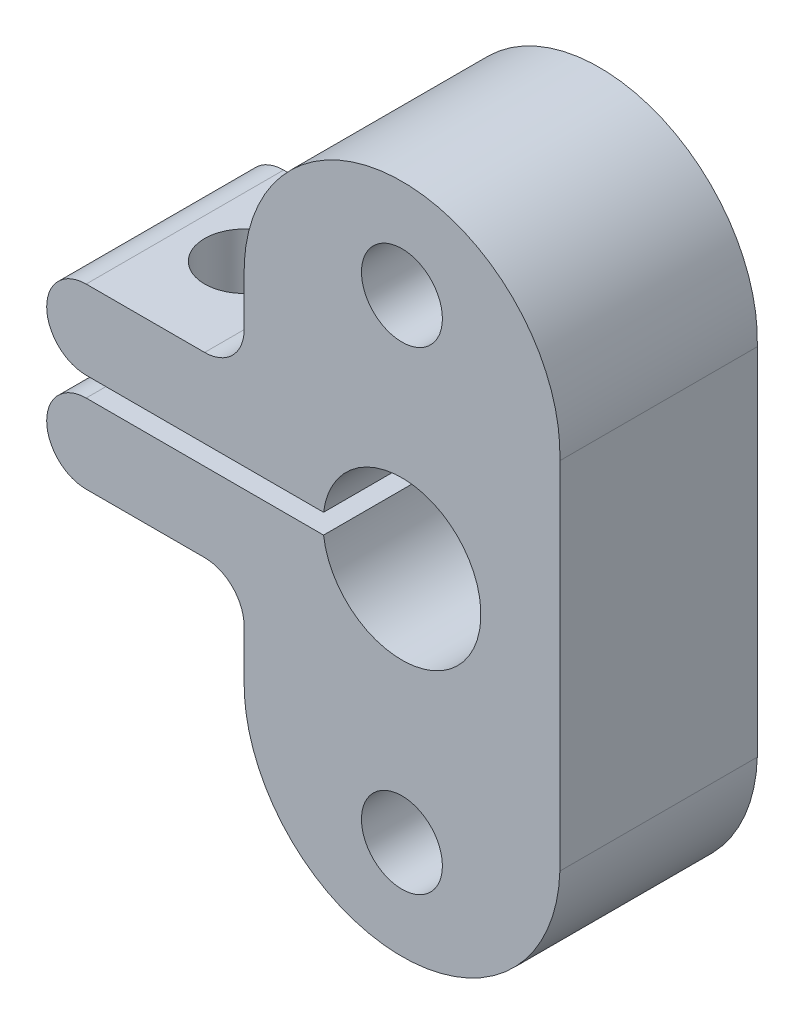
ISO-10303-21;
HEADER;
FILE_DESCRIPTION(('STEP AP214'),'2;1');
FILE_NAME('part.step','',(''),(''),'','','');
FILE_SCHEMA(('AUTOMOTIVE_DESIGN { 1 0 10303 214 1 1 1 1 }'));
ENDSEC;
DATA;
#1=APPLICATION_CONTEXT('core data for automotive mechanical design processes');
#2=APPLICATION_PROTOCOL_DEFINITION('international standard','automotive_design',2000,#1);
#3=PRODUCT_CONTEXT('',#1,'mechanical');
#4=PRODUCT('Part','Part','',(#3));
#5=PRODUCT_RELATED_PRODUCT_CATEGORY('part','',(#4));
#6=PRODUCT_DEFINITION_FORMATION('','',#4);
#7=PRODUCT_DEFINITION_CONTEXT('part definition',#1,'design');
#8=PRODUCT_DEFINITION('design','',#6,#7);
#9=PRODUCT_DEFINITION_SHAPE('','',#8);
#10=(LENGTH_UNIT() NAMED_UNIT(*) SI_UNIT(.MILLI.,.METRE.));
#11=(NAMED_UNIT(*) PLANE_ANGLE_UNIT() SI_UNIT($,.RADIAN.));
#12=(NAMED_UNIT(*) SI_UNIT($,.STERADIAN.) SOLID_ANGLE_UNIT());
#13=UNCERTAINTY_MEASURE_WITH_UNIT(LENGTH_MEASURE(1.E-05),#10,'distance_accuracy_value','');
#14=(GEOMETRIC_REPRESENTATION_CONTEXT(3) GLOBAL_UNCERTAINTY_ASSIGNED_CONTEXT((#13)) GLOBAL_UNIT_ASSIGNED_CONTEXT((#10,
#11,#12)) REPRESENTATION_CONTEXT('',''));
#15=CARTESIAN_POINT('',(0.,0.,0.));
#16=DIRECTION('',(0.,0.,1.));
#17=DIRECTION('',(1.,0.,0.));
#18=AXIS2_PLACEMENT_3D('',#15,#16,#17);
#19=CARTESIAN_POINT('',(0.0040034338750133,-9.00150657949414,10.));
#20=DIRECTION('',(0.,0.,1.));
#21=DIRECTION('',(1.,0.,0.));
#22=AXIS2_PLACEMENT_3D('',#19,#20,#21);
#23=PLANE('',#22);
#24=CARTESIAN_POINT('',(0.,12.,10.));
#25=DIRECTION('',(0.,0.,1.));
#26=DIRECTION('',(1.,0.,0.));
#27=AXIS2_PLACEMENT_3D('',#24,#25,#26);
#28=CIRCLE('',#27,2.05);
#29=CARTESIAN_POINT('',(2.05,12.,10.));
#30=VERTEX_POINT('',#29);
#31=EDGE_CURVE('E362',#30,#30,#28,.T.);
#32=ORIENTED_EDGE('',*,*,#31,.F.);
#33=EDGE_LOOP('',(#32));
#34=FACE_BOUND('',#33,.T.);
#35=CARTESIAN_POINT('',(-15.9920421162998,-2.5,10.));
#36=DIRECTION('',(0.,0.,1.));
#37=DIRECTION('',(1.,0.,0.));
#38=AXIS2_PLACEMENT_3D('',#35,#36,#37);
#39=CIRCLE('',#38,2.);
#40=CARTESIAN_POINT('',(-15.9920421162998,-0.5,10.));
#41=VERTEX_POINT('',#40);
#42=CARTESIAN_POINT('',(-17.9920421162998,-2.5,10.));
#43=VERTEX_POINT('',#42);
#44=EDGE_CURVE('E63',#41,#43,#39,.T.);
#45=ORIENTED_EDGE('',*,*,#44,.T.);
#46=CARTESIAN_POINT('',(-15.9920421162998,-2.5,10.));
#47=DIRECTION('',(0.,0.,1.));
#48=DIRECTION('',(1.,0.,0.));
#49=AXIS2_PLACEMENT_3D('',#46,#47,#48);
#50=CIRCLE('',#49,2.);
#51=CARTESIAN_POINT('',(-15.9920421162998,-4.5,10.));
#52=VERTEX_POINT('',#51);
#53=EDGE_CURVE('E236',#43,#52,#50,.T.);
#54=ORIENTED_EDGE('',*,*,#53,.T.);
#55=DIRECTION('',(1.,0.,0.));
#56=VECTOR('',#55,1.);
#57=CARTESIAN_POINT('',(-17.9920421162998,-4.5,10.));
#58=LINE('',#57,#56);
#59=CARTESIAN_POINT('',(-9.99204211629985,-4.5,10.));
#60=VERTEX_POINT('',#59);
#61=EDGE_CURVE('E353',#52,#60,#58,.T.);
#62=ORIENTED_EDGE('',*,*,#61,.T.);
#63=CARTESIAN_POINT('',(-9.99204211629985,-6.5,10.));
#64=DIRECTION('',(0.,0.,1.));
#65=DIRECTION('',(1.,0.,0.));
#66=AXIS2_PLACEMENT_3D('',#63,#64,#65);
#67=CIRCLE('',#66,2.);
#68=CARTESIAN_POINT('',(-7.99204211629985,-6.5,10.));
#69=VERTEX_POINT('',#68);
#70=EDGE_CURVE('E248',#60,#69,#67,.F.);
#71=ORIENTED_EDGE('',*,*,#70,.T.);
#72=DIRECTION('',(0.,-1.,0.));
#73=VECTOR('',#72,1.);
#74=CARTESIAN_POINT('',(-7.99204211629985,-8.75,10.));
#75=LINE('',#74,#73);
#76=CARTESIAN_POINT('',(-7.99204211629985,-8.75,10.));
#77=VERTEX_POINT('',#76);
#78=EDGE_CURVE('E178',#69,#77,#75,.T.);
#79=ORIENTED_EDGE('',*,*,#78,.T.);
#80=CARTESIAN_POINT('',(0.0040034338750133,-9.00150657949414,10.));
#81=DIRECTION('',(0.,0.,1.));
#82=DIRECTION('',(1.,0.,0.));
#83=AXIS2_PLACEMENT_3D('',#80,#81,#82);
#84=CIRCLE('',#83,8.00000000000001);
#85=CARTESIAN_POINT('',(8.00004901202232,-9.2530122696711,10.));
#86=VERTEX_POINT('',#85);
#87=EDGE_CURVE('E173',#77,#86,#84,.T.);
#88=ORIENTED_EDGE('',*,*,#87,.T.);
#89=DIRECTION('',(-5.296859947763E-06,0.999999999985972,0.));
#90=VECTOR('',#89,1.);
#91=CARTESIAN_POINT('',(8.00004901202232,-9.2530122696711,10.));
#92=LINE('',#91,#90);
#93=CARTESIAN_POINT('',(7.99995366854326,8.7469877300764,10.));
#94=VERTEX_POINT('',#93);
#95=EDGE_CURVE('E162',#86,#94,#92,.T.);
#96=ORIENTED_EDGE('',*,*,#95,.T.);
#97=CARTESIAN_POINT('',(0.0040034338750133,9.00150657949401,10.));
#98=DIRECTION('',(0.,0.,1.));
#99=DIRECTION('',(1.,0.,0.));
#100=AXIS2_PLACEMENT_3D('',#97,#98,#99);
#101=CIRCLE('',#100,8.);
#102=CARTESIAN_POINT('',(-7.99204211629985,8.75,10.));
#103=VERTEX_POINT('',#102);
#104=EDGE_CURVE('E172',#94,#103,#101,.T.);
#105=ORIENTED_EDGE('',*,*,#104,.T.);
#106=DIRECTION('',(0.,-1.,0.));
#107=VECTOR('',#106,1.);
#108=CARTESIAN_POINT('',(-7.99204211629985,4.5,10.));
#109=LINE('',#108,#107);
#110=CARTESIAN_POINT('',(-7.99204211629985,6.5,10.));
#111=VERTEX_POINT('',#110);
#112=EDGE_CURVE('E330',#103,#111,#109,.T.);
#113=ORIENTED_EDGE('',*,*,#112,.T.);
#114=CARTESIAN_POINT('',(-9.99204211629985,6.5,10.));
#115=DIRECTION('',(0.,0.,1.));
#116=DIRECTION('',(1.,0.,0.));
#117=AXIS2_PLACEMENT_3D('',#114,#115,#116);
#118=CIRCLE('',#117,2.);
#119=CARTESIAN_POINT('',(-9.99204211629985,4.5,10.));
#120=VERTEX_POINT('',#119);
#121=EDGE_CURVE('E11',#111,#120,#118,.F.);
#122=ORIENTED_EDGE('',*,*,#121,.T.);
#123=DIRECTION('',(-1.,0.,0.));
#124=VECTOR('',#123,1.);
#125=CARTESIAN_POINT('',(-17.9920421162998,4.49999999999999,10.));
#126=LINE('',#125,#124);
#127=CARTESIAN_POINT('',(-15.9920421162998,4.49999999999999,10.));
#128=VERTEX_POINT('',#127);
#129=EDGE_CURVE('E337',#120,#128,#126,.T.);
#130=ORIENTED_EDGE('',*,*,#129,.T.);
#131=CARTESIAN_POINT('',(-15.9920421162998,2.49999999999999,10.));
#132=DIRECTION('',(0.,0.,1.));
#133=DIRECTION('',(1.,0.,0.));
#134=AXIS2_PLACEMENT_3D('',#131,#132,#133);
#135=CIRCLE('',#134,2.);
#136=CARTESIAN_POINT('',(-17.9920421162998,2.5,10.));
#137=VERTEX_POINT('',#136);
#138=EDGE_CURVE('E228',#128,#137,#135,.T.);
#139=ORIENTED_EDGE('',*,*,#138,.T.);
#140=CARTESIAN_POINT('',(-15.9920421162998,2.5,10.));
#141=DIRECTION('',(0.,0.,1.));
#142=DIRECTION('',(1.,0.,0.));
#143=AXIS2_PLACEMENT_3D('',#140,#141,#142);
#144=CIRCLE('',#143,2.);
#145=CARTESIAN_POINT('',(-15.9920421162998,0.499999999999995,10.));
#146=VERTEX_POINT('',#145);
#147=EDGE_CURVE('E231',#137,#146,#144,.T.);
#148=ORIENTED_EDGE('',*,*,#147,.T.);
#149=DIRECTION('',(1.,0.,0.));
#150=VECTOR('',#149,1.);
#151=CARTESIAN_POINT('',(-8.00000000000001,0.499999999999998,10.));
#152=LINE('',#151,#150);
#153=CARTESIAN_POINT('',(-3.96862696659689,0.499999999999997,10.));
#154=VERTEX_POINT('',#153);
#155=EDGE_CURVE('E341',#146,#154,#152,.T.);
#156=ORIENTED_EDGE('',*,*,#155,.T.);
#157=CARTESIAN_POINT('',(0.,0.,10.));
#158=DIRECTION('',(0.,0.,-1.));
#159=DIRECTION('',(1.,0.,0.));
#160=AXIS2_PLACEMENT_3D('',#157,#158,#159);
#161=CIRCLE('',#160,4.);
#162=CARTESIAN_POINT('',(-3.96862696659689,-0.5,10.));
#163=VERTEX_POINT('',#162);
#164=EDGE_CURVE('E347',#154,#163,#161,.T.);
#165=ORIENTED_EDGE('',*,*,#164,.T.);
#166=DIRECTION('',(-1.,0.,0.));
#167=VECTOR('',#166,1.);
#168=CARTESIAN_POINT('',(-8.00000000000001,-0.5,10.));
#169=LINE('',#168,#167);
#170=EDGE_CURVE('E350',#163,#41,#169,.T.);
#171=ORIENTED_EDGE('',*,*,#170,.T.);
#172=EDGE_LOOP('',(#45,#54,#62,#71,#79,#88,#96,#105,#113,#122,#130,#139,#148,#156,#165,#171));
#173=FACE_BOUND('',#172,.T.);
#174=CARTESIAN_POINT('',(0.,-12.,10.));
#175=DIRECTION('',(0.,0.,1.));
#176=DIRECTION('',(1.,0.,0.));
#177=AXIS2_PLACEMENT_3D('',#174,#175,#176);
#178=CIRCLE('',#177,2.05);
#179=CARTESIAN_POINT('',(2.05,-12.,10.));
#180=VERTEX_POINT('',#179);
#181=EDGE_CURVE('E426',#180,#180,#178,.T.);
#182=ORIENTED_EDGE('',*,*,#181,.F.);
#183=EDGE_LOOP('',(#182));
#184=FACE_BOUND('',#183,.T.);
#185=ADVANCED_FACE('F45',(#34,#173,#184),#23,.T.);
#186=CARTESIAN_POINT('',(0.0040034338750133,-9.00150657949414,0.));
#187=DIRECTION('',(0.,0.,1.));
#188=DIRECTION('',(1.,0.,0.));
#189=AXIS2_PLACEMENT_3D('',#186,#187,#188);
#190=PLANE('',#189);
#191=DIRECTION('',(1.,0.,0.));
#192=VECTOR('',#191,1.);
#193=CARTESIAN_POINT('',(-17.9920421162998,-4.5,0.));
#194=LINE('',#193,#192);
#195=CARTESIAN_POINT('',(-15.9920421162998,-4.5,0.));
#196=VERTEX_POINT('',#195);
#197=CARTESIAN_POINT('',(-9.99204211629985,-4.5,0.));
#198=VERTEX_POINT('',#197);
#199=EDGE_CURVE('E305',#196,#198,#194,.T.);
#200=ORIENTED_EDGE('',*,*,#199,.F.);
#201=CARTESIAN_POINT('',(-15.9920421162998,-2.5,0.));
#202=DIRECTION('',(0.,0.,1.));
#203=DIRECTION('',(1.,0.,0.));
#204=AXIS2_PLACEMENT_3D('',#201,#202,#203);
#205=CIRCLE('',#204,2.);
#206=CARTESIAN_POINT('',(-17.9920421162998,-2.5,0.));
#207=VERTEX_POINT('',#206);
#208=EDGE_CURVE('E225',#196,#207,#205,.F.);
#209=ORIENTED_EDGE('',*,*,#208,.T.);
#210=CARTESIAN_POINT('',(-15.9920421162998,-2.5,0.));
#211=DIRECTION('',(0.,0.,1.));
#212=DIRECTION('',(1.,0.,0.));
#213=AXIS2_PLACEMENT_3D('',#210,#211,#212);
#214=CIRCLE('',#213,2.);
#215=CARTESIAN_POINT('',(-15.9920421162998,-0.499999999999999,0.));
#216=VERTEX_POINT('',#215);
#217=EDGE_CURVE('E222',#207,#216,#214,.F.);
#218=ORIENTED_EDGE('',*,*,#217,.T.);
#219=DIRECTION('',(-1.,0.,0.));
#220=VECTOR('',#219,1.);
#221=CARTESIAN_POINT('',(-8.00000000000001,-0.5,0.));
#222=LINE('',#221,#220);
#223=CARTESIAN_POINT('',(-3.96862696659689,-0.5,0.));
#224=VERTEX_POINT('',#223);
#225=EDGE_CURVE('E302',#224,#216,#222,.T.);
#226=ORIENTED_EDGE('',*,*,#225,.F.);
#227=CARTESIAN_POINT('',(0.,0.,0.));
#228=DIRECTION('',(0.,0.,-1.));
#229=DIRECTION('',(1.,0.,0.));
#230=AXIS2_PLACEMENT_3D('',#227,#228,#229);
#231=CIRCLE('',#230,4.);
#232=CARTESIAN_POINT('',(-3.96862696659689,0.499999999999997,0.));
#233=VERTEX_POINT('',#232);
#234=EDGE_CURVE('E292',#233,#224,#231,.T.);
#235=ORIENTED_EDGE('',*,*,#234,.F.);
#236=DIRECTION('',(1.,0.,0.));
#237=VECTOR('',#236,1.);
#238=CARTESIAN_POINT('',(-8.00000000000001,0.499999999999998,0.));
#239=LINE('',#238,#237);
#240=CARTESIAN_POINT('',(-15.9920421162998,0.499999999999996,0.));
#241=VERTEX_POINT('',#240);
#242=EDGE_CURVE('E287',#241,#233,#239,.T.);
#243=ORIENTED_EDGE('',*,*,#242,.F.);
#244=CARTESIAN_POINT('',(-15.9920421162998,2.5,0.));
#245=DIRECTION('',(0.,0.,1.));
#246=DIRECTION('',(1.,0.,0.));
#247=AXIS2_PLACEMENT_3D('',#244,#245,#246);
#248=CIRCLE('',#247,2.);
#249=CARTESIAN_POINT('',(-17.9920421162998,2.5,0.));
#250=VERTEX_POINT('',#249);
#251=EDGE_CURVE('E219',#241,#250,#248,.F.);
#252=ORIENTED_EDGE('',*,*,#251,.T.);
#253=CARTESIAN_POINT('',(-15.9920421162998,2.49999999999999,0.));
#254=DIRECTION('',(0.,0.,1.));
#255=DIRECTION('',(1.,0.,0.));
#256=AXIS2_PLACEMENT_3D('',#253,#254,#255);
#257=CIRCLE('',#256,2.);
#258=CARTESIAN_POINT('',(-15.9920421162998,4.49999999999999,0.));
#259=VERTEX_POINT('',#258);
#260=EDGE_CURVE('E216',#250,#259,#257,.F.);
#261=ORIENTED_EDGE('',*,*,#260,.T.);
#262=DIRECTION('',(-1.,0.,0.));
#263=VECTOR('',#262,1.);
#264=CARTESIAN_POINT('',(-17.9920421162998,4.49999999999999,0.));
#265=LINE('',#264,#263);
#266=CARTESIAN_POINT('',(-9.99204211629985,4.5,0.));
#267=VERTEX_POINT('',#266);
#268=EDGE_CURVE('E279',#267,#259,#265,.T.);
#269=ORIENTED_EDGE('',*,*,#268,.F.);
#270=CARTESIAN_POINT('',(-9.99204211629985,6.5,0.));
#271=DIRECTION('',(0.,0.,1.));
#272=DIRECTION('',(1.,0.,0.));
#273=AXIS2_PLACEMENT_3D('',#270,#271,#272);
#274=CIRCLE('',#273,2.);
#275=CARTESIAN_POINT('',(-7.99204211629985,6.5,0.));
#276=VERTEX_POINT('',#275);
#277=EDGE_CURVE('E55',#267,#276,#274,.T.);
#278=ORIENTED_EDGE('',*,*,#277,.T.);
#279=DIRECTION('',(0.,-1.,0.));
#280=VECTOR('',#279,1.);
#281=CARTESIAN_POINT('',(-7.99204211629985,4.5,0.));
#282=LINE('',#281,#280);
#283=CARTESIAN_POINT('',(-7.99204211629985,8.75,0.));
#284=VERTEX_POINT('',#283);
#285=EDGE_CURVE('E288',#284,#276,#282,.T.);
#286=ORIENTED_EDGE('',*,*,#285,.F.);
#287=CARTESIAN_POINT('',(0.0040034338750133,9.00150657949401,0.));
#288=DIRECTION('',(0.,0.,1.));
#289=DIRECTION('',(1.,0.,0.));
#290=AXIS2_PLACEMENT_3D('',#287,#288,#289);
#291=CIRCLE('',#290,8.);
#292=CARTESIAN_POINT('',(7.99995366854326,8.7469877300764,0.));
#293=VERTEX_POINT('',#292);
#294=EDGE_CURVE('E295',#293,#284,#291,.T.);
#295=ORIENTED_EDGE('',*,*,#294,.F.);
#296=DIRECTION('',(-5.296859947763E-06,0.999999999985972,0.));
#297=VECTOR('',#296,1.);
#298=CARTESIAN_POINT('',(8.00004901202232,-9.2530122696711,0.));
#299=LINE('',#298,#297);
#300=CARTESIAN_POINT('',(8.00004901202232,-9.2530122696711,0.));
#301=VERTEX_POINT('',#300);
#302=EDGE_CURVE('E361',#301,#293,#299,.T.);
#303=ORIENTED_EDGE('',*,*,#302,.F.);
#304=CARTESIAN_POINT('',(0.0040034338750133,-9.00150657949414,0.));
#305=DIRECTION('',(0.,0.,1.));
#306=DIRECTION('',(1.,0.,0.));
#307=AXIS2_PLACEMENT_3D('',#304,#305,#306);
#308=CIRCLE('',#307,8.00000000000001);
#309=CARTESIAN_POINT('',(-7.99204211629985,-8.75,0.));
#310=VERTEX_POINT('',#309);
#311=EDGE_CURVE('E187',#310,#301,#308,.T.);
#312=ORIENTED_EDGE('',*,*,#311,.F.);
#313=DIRECTION('',(0.,-1.,0.));
#314=VECTOR('',#313,1.);
#315=CARTESIAN_POINT('',(-7.99204211629985,-8.75,0.));
#316=LINE('',#315,#314);
#317=CARTESIAN_POINT('',(-7.99204211629985,-6.5,0.));
#318=VERTEX_POINT('',#317);
#319=EDGE_CURVE('E183',#318,#310,#316,.T.);
#320=ORIENTED_EDGE('',*,*,#319,.F.);
#321=CARTESIAN_POINT('',(-9.99204211629985,-6.5,0.));
#322=DIRECTION('',(0.,0.,1.));
#323=DIRECTION('',(1.,0.,0.));
#324=AXIS2_PLACEMENT_3D('',#321,#322,#323);
#325=CIRCLE('',#324,2.);
#326=EDGE_CURVE('E245',#318,#198,#325,.T.);
#327=ORIENTED_EDGE('',*,*,#326,.T.);
#328=EDGE_LOOP('',(#200,#209,#218,#226,#235,#243,#252,#261,#269,#278,#286,#295,#303,#312,#320,#327));
#329=FACE_BOUND('',#328,.T.);
#330=CARTESIAN_POINT('',(0.,12.,0.));
#331=DIRECTION('',(0.,0.,1.));
#332=DIRECTION('',(1.,0.,0.));
#333=AXIS2_PLACEMENT_3D('',#330,#331,#332);
#334=CIRCLE('',#333,2.05);
#335=CARTESIAN_POINT('',(2.05,12.,0.));
#336=VERTEX_POINT('',#335);
#337=EDGE_CURVE('E430',#336,#336,#334,.T.);
#338=ORIENTED_EDGE('',*,*,#337,.T.);
#339=EDGE_LOOP('',(#338));
#340=FACE_BOUND('',#339,.T.);
#341=CARTESIAN_POINT('',(0.,-12.,0.));
#342=DIRECTION('',(0.,0.,1.));
#343=DIRECTION('',(1.,0.,0.));
#344=AXIS2_PLACEMENT_3D('',#341,#342,#343);
#345=CIRCLE('',#344,2.05);
#346=CARTESIAN_POINT('',(2.05,-12.,0.));
#347=VERTEX_POINT('',#346);
#348=EDGE_CURVE('E425',#347,#347,#345,.T.);
#349=ORIENTED_EDGE('',*,*,#348,.T.);
#350=EDGE_LOOP('',(#349));
#351=FACE_BOUND('',#350,.T.);
#352=ADVANCED_FACE('F277',(#329,#340,#351),#190,.F.);
#353=CARTESIAN_POINT('',(0.0040034338750133,-9.00150657949414,10.));
#354=DIRECTION('',(0.,0.,-1.));
#355=DIRECTION('',(-1.,0.,0.));
#356=AXIS2_PLACEMENT_3D('',#353,#354,#355);
#357=CYLINDRICAL_SURFACE('',#356,8.00000000000001);
#358=ORIENTED_EDGE('',*,*,#311,.T.);
#359=DIRECTION('',(0.,0.,-1.));
#360=VECTOR('',#359,1.);
#361=CARTESIAN_POINT('',(8.00004901202232,-9.2530122696711,10.));
#362=LINE('',#361,#360);
#363=EDGE_CURVE('E166',#86,#301,#362,.T.);
#364=ORIENTED_EDGE('',*,*,#363,.F.);
#365=ORIENTED_EDGE('',*,*,#87,.F.);
#366=DIRECTION('',(0.,0.,-1.));
#367=VECTOR('',#366,1.);
#368=CARTESIAN_POINT('',(-7.99204211629985,-8.75,10.));
#369=LINE('',#368,#367);
#370=EDGE_CURVE('E311',#77,#310,#369,.T.);
#371=ORIENTED_EDGE('',*,*,#370,.T.);
#372=EDGE_LOOP('',(#358,#364,#365,#371));
#373=FACE_BOUND('',#372,.T.);
#374=ADVANCED_FACE('F185',(#373),#357,.T.);
#375=CARTESIAN_POINT('',(8.00004901202232,-9.2530122696711,10.));
#376=DIRECTION('',(-0.999999999985972,-5.296859947763E-06,0.));
#377=DIRECTION('',(5.296859947763E-06,-0.999999999985972,0.));
#378=AXIS2_PLACEMENT_3D('',#375,#376,#377);
#379=PLANE('',#378);
#380=ORIENTED_EDGE('',*,*,#302,.T.);
#381=DIRECTION('',(0.,0.,-1.));
#382=VECTOR('',#381,1.);
#383=CARTESIAN_POINT('',(7.99995366854326,8.7469877300764,10.));
#384=LINE('',#383,#382);
#385=EDGE_CURVE('E169',#94,#293,#384,.T.);
#386=ORIENTED_EDGE('',*,*,#385,.F.);
#387=ORIENTED_EDGE('',*,*,#95,.F.);
#388=ORIENTED_EDGE('',*,*,#363,.T.);
#389=EDGE_LOOP('',(#380,#386,#387,#388));
#390=FACE_BOUND('',#389,.T.);
#391=ADVANCED_FACE('F164',(#390),#379,.F.);
#392=CARTESIAN_POINT('',(0.0040034338750133,9.00150657949401,10.));
#393=DIRECTION('',(0.,0.,-1.));
#394=DIRECTION('',(-1.,0.,0.));
#395=AXIS2_PLACEMENT_3D('',#392,#393,#394);
#396=CYLINDRICAL_SURFACE('',#395,8.);
#397=ORIENTED_EDGE('',*,*,#294,.T.);
#398=DIRECTION('',(0.,0.,-1.));
#399=VECTOR('',#398,1.);
#400=CARTESIAN_POINT('',(-7.99204211629985,8.75,10.));
#401=LINE('',#400,#399);
#402=EDGE_CURVE('E196',#103,#284,#401,.T.);
#403=ORIENTED_EDGE('',*,*,#402,.F.);
#404=ORIENTED_EDGE('',*,*,#104,.F.);
#405=ORIENTED_EDGE('',*,*,#385,.T.);
#406=EDGE_LOOP('',(#397,#403,#404,#405));
#407=FACE_BOUND('',#406,.T.);
#408=ADVANCED_FACE('F365',(#407),#396,.T.);
#409=CARTESIAN_POINT('',(-7.99204211629985,4.5,10.));
#410=DIRECTION('',(1.,0.,0.));
#411=DIRECTION('',(0.,0.,-1.));
#412=AXIS2_PLACEMENT_3D('',#409,#410,#411);
#413=PLANE('',#412);
#414=ORIENTED_EDGE('',*,*,#285,.T.);
#415=DIRECTION('',(0.,0.,-1.));
#416=VECTOR('',#415,1.);
#417=CARTESIAN_POINT('',(-7.99204211629985,6.5,10.));
#418=LINE('',#417,#416);
#419=EDGE_CURVE('E213',#276,#111,#418,.F.);
#420=ORIENTED_EDGE('',*,*,#419,.T.);
#421=ORIENTED_EDGE('',*,*,#112,.F.);
#422=ORIENTED_EDGE('',*,*,#402,.T.);
#423=EDGE_LOOP('',(#414,#420,#421,#422));
#424=FACE_BOUND('',#423,.T.);
#425=ADVANCED_FACE('F327',(#424),#413,.F.);
#426=CARTESIAN_POINT('',(-17.9920421162998,4.49999999999999,10.));
#427=DIRECTION('',(0.,-1.,0.));
#428=DIRECTION('',(1.,0.,0.));
#429=AXIS2_PLACEMENT_3D('',#426,#427,#428);
#430=PLANE('',#429);
#431=CARTESIAN_POINT('',(-12.9920421162998,4.5,5.));
#432=DIRECTION('',(0.,-1.,0.));
#433=DIRECTION('',(1.,0.,0.));
#434=AXIS2_PLACEMENT_3D('',#431,#432,#433);
#435=CIRCLE('',#434,2.);
#436=CARTESIAN_POINT('',(-10.9920421162998,4.5,5.));
#437=VERTEX_POINT('',#436);
#438=EDGE_CURVE('E261',#437,#437,#435,.F.);
#439=ORIENTED_EDGE('',*,*,#438,.F.);
#440=EDGE_LOOP('',(#439));
#441=FACE_BOUND('',#440,.T.);
#442=ORIENTED_EDGE('',*,*,#129,.F.);
#443=DIRECTION('',(0.,0.,-1.));
#444=VECTOR('',#443,1.);
#445=CARTESIAN_POINT('',(-9.99204211629985,4.5,0.));
#446=LINE('',#445,#444);
#447=EDGE_CURVE('E209',#120,#267,#446,.T.);
#448=ORIENTED_EDGE('',*,*,#447,.T.);
#449=ORIENTED_EDGE('',*,*,#268,.T.);
#450=DIRECTION('',(0.,0.,-1.));
#451=VECTOR('',#450,1.);
#452=CARTESIAN_POINT('',(-15.9920421162998,4.49999999999999,10.));
#453=LINE('',#452,#451);
#454=EDGE_CURVE('E206',#259,#128,#453,.F.);
#455=ORIENTED_EDGE('',*,*,#454,.T.);
#456=EDGE_LOOP('',(#442,#448,#449,#455));
#457=FACE_BOUND('',#456,.T.);
#458=ADVANCED_FACE('F283',(#441,#457),#430,.F.);
#459=CARTESIAN_POINT('',(-8.00000000000001,0.499999999999998,10.));
#460=DIRECTION('',(0.,1.,0.));
#461=DIRECTION('',(-1.,0.,0.));
#462=AXIS2_PLACEMENT_3D('',#459,#460,#461);
#463=PLANE('',#462);
#464=CARTESIAN_POINT('',(-12.9920421162998,0.499999999999995,5.));
#465=DIRECTION('',(0.,1.,0.));
#466=DIRECTION('',(-1.,0.,0.));
#467=AXIS2_PLACEMENT_3D('',#464,#465,#466);
#468=CIRCLE('',#467,2.);
#469=CARTESIAN_POINT('',(-14.9920421162998,0.499999999999995,5.));
#470=VERTEX_POINT('',#469);
#471=EDGE_CURVE('E419',#470,#470,#468,.T.);
#472=ORIENTED_EDGE('',*,*,#471,.T.);
#473=EDGE_LOOP('',(#472));
#474=FACE_BOUND('',#473,.T.);
#475=ORIENTED_EDGE('',*,*,#155,.F.);
#476=DIRECTION('',(0.,0.,-1.));
#477=VECTOR('',#476,1.);
#478=CARTESIAN_POINT('',(-15.9920421162998,0.499999999999996,10.));
#479=LINE('',#478,#477);
#480=EDGE_CURVE('E239',#146,#241,#479,.T.);
#481=ORIENTED_EDGE('',*,*,#480,.T.);
#482=ORIENTED_EDGE('',*,*,#242,.T.);
#483=DIRECTION('',(0.,0.,-1.));
#484=VECTOR('',#483,1.);
#485=CARTESIAN_POINT('',(-3.96862696659689,0.499999999999997,10.));
#486=LINE('',#485,#484);
#487=EDGE_CURVE('E318',#154,#233,#486,.T.);
#488=ORIENTED_EDGE('',*,*,#487,.F.);
#489=EDGE_LOOP('',(#475,#481,#482,#488));
#490=FACE_BOUND('',#489,.T.);
#491=ADVANCED_FACE('F402',(#474,#490),#463,.F.);
#492=CARTESIAN_POINT('',(0.,0.,10.));
#493=DIRECTION('',(0.,0.,-1.));
#494=DIRECTION('',(-1.,0.,0.));
#495=AXIS2_PLACEMENT_3D('',#492,#493,#494);
#496=CYLINDRICAL_SURFACE('',#495,4.);
#497=ORIENTED_EDGE('',*,*,#234,.T.);
#498=DIRECTION('',(0.,0.,-1.));
#499=VECTOR('',#498,1.);
#500=CARTESIAN_POINT('',(-3.96862696659689,-0.5,10.));
#501=LINE('',#500,#499);
#502=EDGE_CURVE('E314',#163,#224,#501,.T.);
#503=ORIENTED_EDGE('',*,*,#502,.F.);
#504=ORIENTED_EDGE('',*,*,#164,.F.);
#505=ORIENTED_EDGE('',*,*,#487,.T.);
#506=EDGE_LOOP('',(#497,#503,#504,#505));
#507=FACE_BOUND('',#506,.T.);
#508=ADVANCED_FACE('F399',(#507),#496,.F.);
#509=CARTESIAN_POINT('',(-8.00000000000001,-0.5,10.));
#510=DIRECTION('',(0.,-1.,0.));
#511=DIRECTION('',(1.,0.,0.));
#512=AXIS2_PLACEMENT_3D('',#509,#510,#511);
#513=PLANE('',#512);
#514=CARTESIAN_POINT('',(-12.9920421162998,-0.5,5.));
#515=DIRECTION('',(0.,-1.,0.));
#516=DIRECTION('',(1.,0.,0.));
#517=AXIS2_PLACEMENT_3D('',#514,#515,#516);
#518=CIRCLE('',#517,2.);
#519=CARTESIAN_POINT('',(-10.9920421162998,-0.500000000000001,5.));
#520=VERTEX_POINT('',#519);
#521=EDGE_CURVE('E415',#520,#520,#518,.T.);
#522=ORIENTED_EDGE('',*,*,#521,.T.);
#523=EDGE_LOOP('',(#522));
#524=FACE_BOUND('',#523,.T.);
#525=ORIENTED_EDGE('',*,*,#225,.T.);
#526=DIRECTION('',(0.,0.,-1.));
#527=VECTOR('',#526,1.);
#528=CARTESIAN_POINT('',(-15.9920421162998,-0.499999999999999,10.));
#529=LINE('',#528,#527);
#530=EDGE_CURVE('E71',#216,#41,#529,.F.);
#531=ORIENTED_EDGE('',*,*,#530,.T.);
#532=ORIENTED_EDGE('',*,*,#170,.F.);
#533=ORIENTED_EDGE('',*,*,#502,.T.);
#534=EDGE_LOOP('',(#525,#531,#532,#533));
#535=FACE_BOUND('',#534,.T.);
#536=ADVANCED_FACE('F395',(#524,#535),#513,.F.);
#537=CARTESIAN_POINT('',(-17.9920421162998,-4.5,10.));
#538=DIRECTION('',(0.,1.,0.));
#539=DIRECTION('',(-1.,0.,0.));
#540=AXIS2_PLACEMENT_3D('',#537,#538,#539);
#541=PLANE('',#540);
#542=CARTESIAN_POINT('',(-12.9920421162998,-4.5,5.));
#543=DIRECTION('',(0.,-1.,0.));
#544=DIRECTION('',(1.,0.,0.));
#545=AXIS2_PLACEMENT_3D('',#542,#543,#544);
#546=CIRCLE('',#545,2.);
#547=CARTESIAN_POINT('',(-10.9920421162998,-4.5,5.));
#548=VERTEX_POINT('',#547);
#549=EDGE_CURVE('E255',#548,#548,#546,.T.);
#550=ORIENTED_EDGE('',*,*,#549,.F.);
#551=EDGE_LOOP('',(#550));
#552=FACE_BOUND('',#551,.T.);
#553=ORIENTED_EDGE('',*,*,#199,.T.);
#554=DIRECTION('',(0.,0.,-1.));
#555=VECTOR('',#554,1.);
#556=CARTESIAN_POINT('',(-9.99204211629985,-4.5,10.));
#557=LINE('',#556,#555);
#558=EDGE_CURVE('E203',#198,#60,#557,.F.);
#559=ORIENTED_EDGE('',*,*,#558,.T.);
#560=ORIENTED_EDGE('',*,*,#61,.F.);
#561=DIRECTION('',(0.,0.,-1.));
#562=VECTOR('',#561,1.);
#563=CARTESIAN_POINT('',(-15.9920421162998,-4.5,10.));
#564=LINE('',#563,#562);
#565=EDGE_CURVE('E194',#52,#196,#564,.T.);
#566=ORIENTED_EDGE('',*,*,#565,.T.);
#567=EDGE_LOOP('',(#553,#559,#560,#566));
#568=FACE_BOUND('',#567,.T.);
#569=ADVANCED_FACE('F391',(#552,#568),#541,.F.);
#570=CARTESIAN_POINT('',(-7.99204211629985,-8.75,10.));
#571=DIRECTION('',(1.,0.,0.));
#572=DIRECTION('',(0.,1.,0.));
#573=AXIS2_PLACEMENT_3D('',#570,#571,#572);
#574=PLANE('',#573);
#575=ORIENTED_EDGE('',*,*,#78,.F.);
#576=DIRECTION('',(0.,0.,-1.));
#577=VECTOR('',#576,1.);
#578=CARTESIAN_POINT('',(-7.99204211629985,-6.5,0.));
#579=LINE('',#578,#577);
#580=EDGE_CURVE('E189',#69,#318,#579,.T.);
#581=ORIENTED_EDGE('',*,*,#580,.T.);
#582=ORIENTED_EDGE('',*,*,#319,.T.);
#583=ORIENTED_EDGE('',*,*,#370,.F.);
#584=EDGE_LOOP('',(#575,#581,#582,#583));
#585=FACE_BOUND('',#584,.T.);
#586=ADVANCED_FACE('F388',(#585),#574,.F.);
#587=CARTESIAN_POINT('',(0.,12.,10.));
#588=DIRECTION('',(0.,0.,-1.));
#589=DIRECTION('',(-1.,0.,0.));
#590=AXIS2_PLACEMENT_3D('',#587,#588,#589);
#591=CYLINDRICAL_SURFACE('',#590,2.05);
#592=ORIENTED_EDGE('',*,*,#31,.T.);
#593=EDGE_LOOP('',(#592));
#594=FACE_BOUND('',#593,.T.);
#595=ORIENTED_EDGE('',*,*,#337,.F.);
#596=EDGE_LOOP('',(#595));
#597=FACE_BOUND('',#596,.T.);
#598=ADVANCED_FACE('F385',(#594,#597),#591,.F.);
#599=CARTESIAN_POINT('',(0.,-12.,10.));
#600=DIRECTION('',(0.,0.,-1.));
#601=DIRECTION('',(-1.,0.,0.));
#602=AXIS2_PLACEMENT_3D('',#599,#600,#601);
#603=CYLINDRICAL_SURFACE('',#602,2.05);
#604=ORIENTED_EDGE('',*,*,#181,.T.);
#605=EDGE_LOOP('',(#604));
#606=FACE_BOUND('',#605,.T.);
#607=ORIENTED_EDGE('',*,*,#348,.F.);
#608=EDGE_LOOP('',(#607));
#609=FACE_BOUND('',#608,.T.);
#610=ADVANCED_FACE('F443',(#606,#609),#603,.F.);
#611=CARTESIAN_POINT('',(-12.9920421162998,10.1568542494924,5.));
#612=DIRECTION('',(0.,-1.,0.));
#613=DIRECTION('',(1.,0.,0.));
#614=AXIS2_PLACEMENT_3D('',#611,#612,#613);
#615=CYLINDRICAL_SURFACE('',#614,2.);
#616=ORIENTED_EDGE('',*,*,#549,.T.);
#617=EDGE_LOOP('',(#616));
#618=FACE_BOUND('',#617,.T.);
#619=ORIENTED_EDGE('',*,*,#521,.F.);
#620=EDGE_LOOP('',(#619));
#621=FACE_BOUND('',#620,.T.);
#622=ADVANCED_FACE('F448',(#618,#621),#615,.F.);
#623=ORIENTED_EDGE('',*,*,#438,.T.);
#624=EDGE_LOOP('',(#623));
#625=FACE_BOUND('',#624,.T.);
#626=ORIENTED_EDGE('',*,*,#471,.F.);
#627=EDGE_LOOP('',(#626));
#628=FACE_BOUND('',#627,.T.);
#629=ADVANCED_FACE('F453',(#625,#628),#615,.F.);
#630=CARTESIAN_POINT('',(-9.99204211629985,-6.5,10.));
#631=DIRECTION('',(0.,0.,1.));
#632=DIRECTION('',(1.,0.,0.));
#633=AXIS2_PLACEMENT_3D('',#630,#631,#632);
#634=CYLINDRICAL_SURFACE('',#633,2.);
#635=ORIENTED_EDGE('',*,*,#70,.F.);
#636=ORIENTED_EDGE('',*,*,#558,.F.);
#637=ORIENTED_EDGE('',*,*,#326,.F.);
#638=ORIENTED_EDGE('',*,*,#580,.F.);
#639=EDGE_LOOP('',(#635,#636,#637,#638));
#640=FACE_BOUND('',#639,.T.);
#641=ADVANCED_FACE('F457',(#640),#634,.F.);
#642=CARTESIAN_POINT('',(-9.99204211629985,6.5,10.));
#643=DIRECTION('',(0.,0.,1.));
#644=DIRECTION('',(1.,0.,0.));
#645=AXIS2_PLACEMENT_3D('',#642,#643,#644);
#646=CYLINDRICAL_SURFACE('',#645,2.);
#647=ORIENTED_EDGE('',*,*,#121,.F.);
#648=ORIENTED_EDGE('',*,*,#419,.F.);
#649=ORIENTED_EDGE('',*,*,#277,.F.);
#650=ORIENTED_EDGE('',*,*,#447,.F.);
#651=EDGE_LOOP('',(#647,#648,#649,#650));
#652=FACE_BOUND('',#651,.T.);
#653=ADVANCED_FACE('F335',(#652),#646,.F.);
#654=CARTESIAN_POINT('',(-15.9920421162998,-2.5,10.));
#655=DIRECTION('',(0.,0.,-1.));
#656=DIRECTION('',(-1.,0.,0.));
#657=AXIS2_PLACEMENT_3D('',#654,#655,#656);
#658=CYLINDRICAL_SURFACE('',#657,2.);
#659=DIRECTION('',(0.,0.,-1.));
#660=VECTOR('',#659,1.);
#661=CARTESIAN_POINT('',(-17.9920421162998,-2.5,10.));
#662=LINE('',#661,#660);
#663=EDGE_CURVE('E252',#43,#207,#662,.T.);
#664=ORIENTED_EDGE('',*,*,#663,.F.);
#665=ORIENTED_EDGE('',*,*,#44,.F.);
#666=ORIENTED_EDGE('',*,*,#530,.F.);
#667=ORIENTED_EDGE('',*,*,#217,.F.);
#668=EDGE_LOOP('',(#664,#665,#666,#667));
#669=FACE_BOUND('',#668,.T.);
#670=ADVANCED_FACE('F473',(#669),#658,.T.);
#671=CARTESIAN_POINT('',(-15.9920421162998,-2.5,10.));
#672=DIRECTION('',(0.,0.,-1.));
#673=DIRECTION('',(-1.,0.,0.));
#674=AXIS2_PLACEMENT_3D('',#671,#672,#673);
#675=CYLINDRICAL_SURFACE('',#674,2.);
#676=ORIENTED_EDGE('',*,*,#53,.F.);
#677=ORIENTED_EDGE('',*,*,#663,.T.);
#678=ORIENTED_EDGE('',*,*,#208,.F.);
#679=ORIENTED_EDGE('',*,*,#565,.F.);
#680=EDGE_LOOP('',(#676,#677,#678,#679));
#681=FACE_BOUND('',#680,.T.);
#682=ADVANCED_FACE('F475',(#681),#675,.T.);
#683=CARTESIAN_POINT('',(-15.9920421162998,2.49999999999999,10.));
#684=DIRECTION('',(0.,0.,-1.));
#685=DIRECTION('',(-1.,0.,0.));
#686=AXIS2_PLACEMENT_3D('',#683,#684,#685);
#687=CYLINDRICAL_SURFACE('',#686,2.);
#688=DIRECTION('',(0.,0.,-1.));
#689=VECTOR('',#688,1.);
#690=CARTESIAN_POINT('',(-17.9920421162998,2.5,10.));
#691=LINE('',#690,#689);
#692=EDGE_CURVE('E49',#137,#250,#691,.T.);
#693=ORIENTED_EDGE('',*,*,#692,.F.);
#694=ORIENTED_EDGE('',*,*,#138,.F.);
#695=ORIENTED_EDGE('',*,*,#454,.F.);
#696=ORIENTED_EDGE('',*,*,#260,.F.);
#697=EDGE_LOOP('',(#693,#694,#695,#696));
#698=FACE_BOUND('',#697,.T.);
#699=ADVANCED_FACE('F47',(#698),#687,.T.);
#700=CARTESIAN_POINT('',(-15.9920421162998,2.5,10.));
#701=DIRECTION('',(0.,0.,-1.));
#702=DIRECTION('',(-1.,0.,0.));
#703=AXIS2_PLACEMENT_3D('',#700,#701,#702);
#704=CYLINDRICAL_SURFACE('',#703,2.);
#705=ORIENTED_EDGE('',*,*,#147,.F.);
#706=ORIENTED_EDGE('',*,*,#692,.T.);
#707=ORIENTED_EDGE('',*,*,#251,.F.);
#708=ORIENTED_EDGE('',*,*,#480,.F.);
#709=EDGE_LOOP('',(#705,#706,#707,#708));
#710=FACE_BOUND('',#709,.T.);
#711=ADVANCED_FACE('F267',(#710),#704,.T.);
#712=CLOSED_SHELL('',(#185,#352,#374,#391,#408,#425,#458,#491,#508,#536,#569,#586,#598,#610,
#622,#629,#641,#653,#670,#682,#699,#711));
#713=MANIFOLD_SOLID_BREP('B2',#712);
#714=ADVANCED_BREP_SHAPE_REPRESENTATION('',(#18,#713),#14);
#715=SHAPE_DEFINITION_REPRESENTATION(#9,#714);
ENDSEC;
END-ISO-10303-21;
